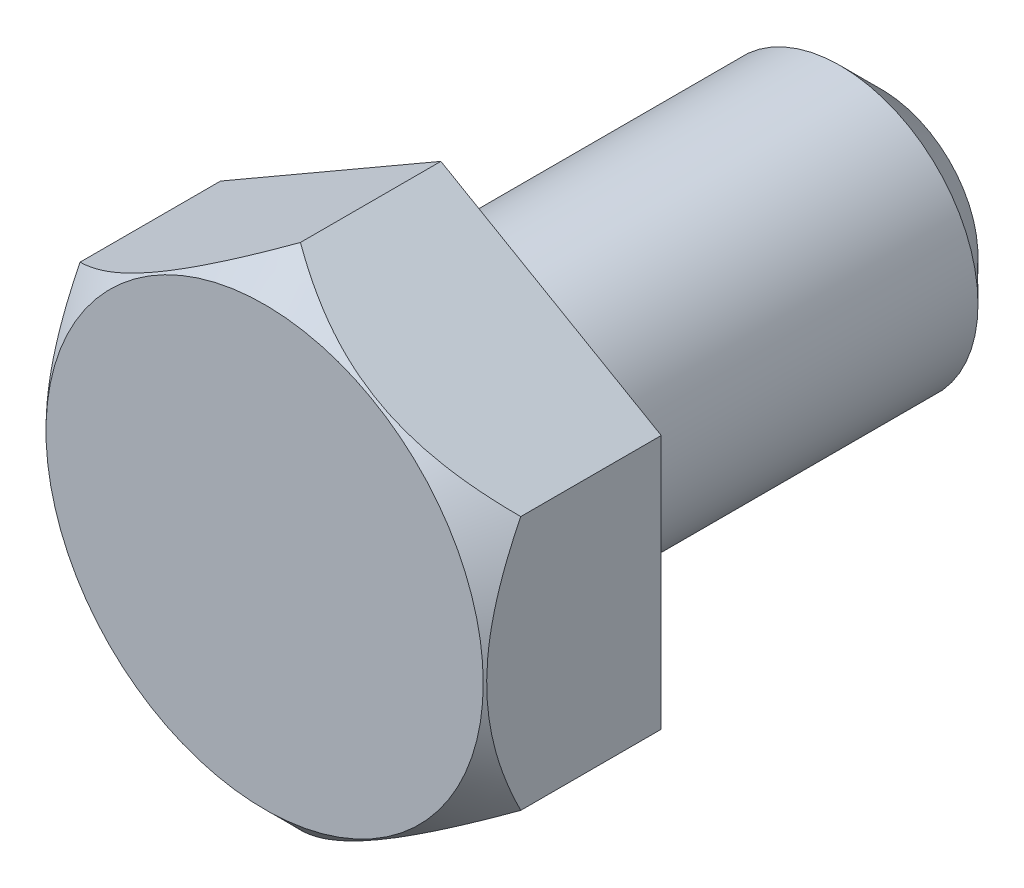
ISO-10303-21;
HEADER;
FILE_DESCRIPTION(('STEP AP214'),'2;1');
FILE_NAME('part.step','',(''),(''),'','','');
FILE_SCHEMA(('AUTOMOTIVE_DESIGN { 1 0 10303 214 1 1 1 1 }'));
ENDSEC;
DATA;
#1=APPLICATION_CONTEXT('core data for automotive mechanical design processes');
#2=APPLICATION_PROTOCOL_DEFINITION('international standard','automotive_design',2000,#1);
#3=PRODUCT_CONTEXT('',#1,'mechanical');
#4=PRODUCT('Part','Part','',(#3));
#5=PRODUCT_RELATED_PRODUCT_CATEGORY('part','',(#4));
#6=PRODUCT_DEFINITION_FORMATION('','',#4);
#7=PRODUCT_DEFINITION_CONTEXT('part definition',#1,'design');
#8=PRODUCT_DEFINITION('design','',#6,#7);
#9=PRODUCT_DEFINITION_SHAPE('','',#8);
#10=(LENGTH_UNIT() NAMED_UNIT(*) SI_UNIT(.MILLI.,.METRE.));
#11=(NAMED_UNIT(*) PLANE_ANGLE_UNIT() SI_UNIT($,.RADIAN.));
#12=(NAMED_UNIT(*) SI_UNIT($,.STERADIAN.) SOLID_ANGLE_UNIT());
#13=UNCERTAINTY_MEASURE_WITH_UNIT(LENGTH_MEASURE(1.E-05),#10,'distance_accuracy_value','');
#14=(GEOMETRIC_REPRESENTATION_CONTEXT(3) GLOBAL_UNCERTAINTY_ASSIGNED_CONTEXT((#13)) GLOBAL_UNIT_ASSIGNED_CONTEXT((#10,
#11,#12)) REPRESENTATION_CONTEXT('',''));
#15=CARTESIAN_POINT('',(0.,0.,0.));
#16=DIRECTION('',(0.,0.,1.));
#17=DIRECTION('',(1.,0.,0.));
#18=AXIS2_PLACEMENT_3D('',#15,#16,#17);
#19=CARTESIAN_POINT('',(8.,4.61880215351701,6.4));
#20=DIRECTION('',(-0.5,-0.866025403784439,0.));
#21=DIRECTION('',(0.866025403784439,-0.5,0.));
#22=AXIS2_PLACEMENT_3D('',#19,#20,#21);
#23=PLANE('',#22);
#24=CARTESIAN_POINT('',(8.0002,4.61868668346317,5.09988452778112));
#25=CARTESIAN_POINT('',(7.86264718850931,4.69810283620511,5.17929173848282));
#26=CARTESIAN_POINT('',(7.72403708946879,4.77812941419855,5.25626202615978));
#27=CARTESIAN_POINT('',(7.44449490186068,4.93952317146396,5.40458746827087));
#28=CARTESIAN_POINT('',(7.3035615952474,5.02089105397492,5.47593955604614));
#29=CARTESIAN_POINT('',(6.87565651749366,5.26794216580365,5.6810650141855));
#30=CARTESIAN_POINT('',(6.58506238022503,5.43571676918061,5.80503254964343));
#31=CARTESIAN_POINT('',(5.99905611151746,5.77404764616574,6.0173182473915));
#32=CARTESIAN_POINT('',(5.70379374903563,5.94451745062619,6.10617121244411));
#33=CARTESIAN_POINT('',(5.25604614112777,6.2030246525808,6.20895214099946));
#34=CARTESIAN_POINT('',(5.10613774993224,6.28957430259132,6.23811561978319));
#35=CARTESIAN_POINT('',(4.80505172243293,6.46340640161728,6.28561647991033));
#36=CARTESIAN_POINT('',(4.65387427922754,6.55068873914732,6.30395547906862));
#37=CARTESIAN_POINT('',(4.2854726454627,6.76338552157134,6.33470362617771));
#38=CARTESIAN_POINT('',(4.06785151206182,6.88902914152169,6.34115496190079));
#39=CARTESIAN_POINT('',(3.63300150689388,7.14008990906252,6.33032538290011));
#40=CARTESIAN_POINT('',(3.4157727993483,7.26550696183967,6.31303614927477));
#41=CARTESIAN_POINT('',(2.98336341648152,7.51515863543793,6.25574456625223));
#42=CARTESIAN_POINT('',(2.76818530541246,7.63939177578737,6.21571681806485));
#43=CARTESIAN_POINT('',(2.34152748187323,7.8857227850596,6.11512435942803));
#44=CARTESIAN_POINT('',(2.1300474871093,8.00782081696477,6.05456122379639));
#45=CARTESIAN_POINT('',(1.75463860257918,8.22456323750441,5.92996636349631));
#46=CARTESIAN_POINT('',(1.58987832632788,8.31968762734986,5.86921187770629));
#47=CARTESIAN_POINT('',(1.26331530740291,8.50822887423357,5.73791284582758));
#48=CARTESIAN_POINT('',(1.10151265446656,8.60164567946197,5.66736800324559));
#49=CARTESIAN_POINT('',(0.781374515263976,8.78647752030844,5.51806952990987));
#50=CARTESIAN_POINT('',(0.623029924219257,8.87789781257283,5.43934171455633));
#51=CARTESIAN_POINT('',(0.309272732360313,9.05904561175277,5.27471082572869));
#52=CARTESIAN_POINT('',(0.153858404368318,9.14877411585488,5.18881215204212));
#53=CARTESIAN_POINT('',(-0.000200000000000165,9.23771977708785,5.09988452778112));
#54=B_SPLINE_CURVE_WITH_KNOTS('',3,(#24,#25,#26,#27,#28,#29,#30,#31,#32,#33,#34,#35,#36,#37,#38,
#39,#40,#41,#42,#43,#44,#45,#46,#47,#48,#49,#50,#51,#52,#53),.UNSPECIFIED.,.F.,.F.,(4,2,2,2,2,2,
2,2,2,2,2,2,2,2,4),(0.,0.53269658039059,1.06568194267353,2.13740664213606,3.19211397028664,
3.71843331125697,4.244673969182,4.99761238034705,5.75081469500556,6.50485999129144,
7.25884747442539,7.85770857481704,8.45658781520819,9.05363199316845,9.65031250088063),.UNSPECIFIED.);
#55=CARTESIAN_POINT('',(8.,4.61880215351701,5.1));
#56=VERTEX_POINT('',#55);
#57=CARTESIAN_POINT('',(0.,9.23760430703401,5.1));
#58=VERTEX_POINT('',#57);
#59=EDGE_CURVE('E83',#56,#58,#54,.T.);
#60=ORIENTED_EDGE('',*,*,#59,.F.);
#61=DIRECTION('',(0.,0.,-1.));
#62=VECTOR('',#61,1.);
#63=CARTESIAN_POINT('',(8.,4.61880215351701,6.4));
#64=LINE('',#63,#62);
#65=CARTESIAN_POINT('',(8.,4.61880215351701,0.));
#66=VERTEX_POINT('',#65);
#67=EDGE_CURVE('E52',#56,#66,#64,.T.);
#68=ORIENTED_EDGE('',*,*,#67,.T.);
#69=DIRECTION('',(-0.866025403784439,0.5,0.));
#70=VECTOR('',#69,1.);
#71=CARTESIAN_POINT('',(8.,4.61880215351701,0.));
#72=LINE('',#71,#70);
#73=CARTESIAN_POINT('',(0.,9.23760430703401,0.));
#74=VERTEX_POINT('',#73);
#75=EDGE_CURVE('E91',#66,#74,#72,.T.);
#76=ORIENTED_EDGE('',*,*,#75,.T.);
#77=DIRECTION('',(0.,0.,-1.));
#78=VECTOR('',#77,1.);
#79=CARTESIAN_POINT('',(0.,9.23760430703401,6.4));
#80=LINE('',#79,#78);
#81=EDGE_CURVE('E90',#58,#74,#80,.T.);
#82=ORIENTED_EDGE('',*,*,#81,.F.);
#83=EDGE_LOOP('',(#60,#68,#76,#82));
#84=FACE_BOUND('',#83,.T.);
#85=ADVANCED_FACE('F29',(#84),#23,.F.);
#86=CARTESIAN_POINT('',(0.,9.23760430703401,6.4));
#87=DIRECTION('',(0.5,-0.866025403784439,0.));
#88=DIRECTION('',(0.866025403784439,0.5,0.));
#89=AXIS2_PLACEMENT_3D('',#86,#87,#88);
#90=PLANE('',#89);
#91=CARTESIAN_POINT('',(0.000200000000000048,9.23771977708785,5.09988452778113));
#92=CARTESIAN_POINT('',(-0.137352811490684,9.15830362434591,5.17929173848282));
#93=CARTESIAN_POINT('',(-0.275962910531205,9.07827704635247,5.25626202615978));
#94=CARTESIAN_POINT('',(-0.555505098139321,8.91688328908706,5.40458746827087));
#95=CARTESIAN_POINT('',(-0.696438404752601,8.8355154065761,5.47593955604614));
#96=CARTESIAN_POINT('',(-1.12434348250634,8.58846429474738,5.6810650141855));
#97=CARTESIAN_POINT('',(-1.41493761977496,8.42068969137041,5.80503254964343));
#98=CARTESIAN_POINT('',(-2.00094388848254,8.08235881438528,6.0173182473915));
#99=CARTESIAN_POINT('',(-2.29620625096436,7.91188900992484,6.10617121244411));
#100=CARTESIAN_POINT('',(-2.74395385887223,7.65338180797022,6.20895214099946));
#101=CARTESIAN_POINT('',(-2.89386225006775,7.5668321579597,6.23811561978319));
#102=CARTESIAN_POINT('',(-3.19494827756706,7.39300005893374,6.28561647991033));
#103=CARTESIAN_POINT('',(-3.34612572077245,7.3057177214037,6.30395547906862));
#104=CARTESIAN_POINT('',(-3.71452735453729,7.09302093897968,6.33470362617772));
#105=CARTESIAN_POINT('',(-3.93214848793817,6.96737731902933,6.34115496190079));
#106=CARTESIAN_POINT('',(-4.36699849310612,6.7163165514885,6.33032538290011));
#107=CARTESIAN_POINT('',(-4.5842272006517,6.59089949871135,6.31303614927477));
#108=CARTESIAN_POINT('',(-5.01663658351847,6.3412478251131,6.25574456625223));
#109=CARTESIAN_POINT('',(-5.23181469458754,6.21701468476366,6.21571681806485));
#110=CARTESIAN_POINT('',(-5.65847251812676,5.97068367549142,6.11512435942804));
#111=CARTESIAN_POINT('',(-5.8699525128907,5.84858564358625,6.05456122379639));
#112=CARTESIAN_POINT('',(-6.24536139742081,5.63184322304661,5.92996636349631));
#113=CARTESIAN_POINT('',(-6.41012167367211,5.53671883320116,5.86921187770629));
#114=CARTESIAN_POINT('',(-6.73668469259708,5.34817758631745,5.73791284582758));
#115=CARTESIAN_POINT('',(-6.89848734553344,5.25476078108905,5.6673680032456));
#116=CARTESIAN_POINT('',(-7.21862548473602,5.06992894024258,5.51806952990987));
#117=CARTESIAN_POINT('',(-7.37697007578074,4.97850864797819,5.43934171455634));
#118=CARTESIAN_POINT('',(-7.69072726763969,4.79736084879824,5.27471082572869));
#119=CARTESIAN_POINT('',(-7.84614159563168,4.70763234469614,5.18881215204212));
#120=CARTESIAN_POINT('',(-8.0002,4.61868668346317,5.09988452778112));
#121=B_SPLINE_CURVE_WITH_KNOTS('',3,(#91,#92,#93,#94,#95,#96,#97,#98,#99,#100,#101,#102,#103,
#104,#105,#106,#107,#108,#109,#110,#111,#112,#113,#114,#115,#116,#117,#118,#119,#120),
.UNSPECIFIED.,.F.,.F.,(4,2,2,2,2,2,2,2,2,2,2,2,2,2,4),(0.,0.532696580390589,1.06568194267353,
2.13740664213606,3.19211397028664,3.71843331125696,4.24467396918199,4.99761238034705,
5.75081469500556,6.50485999129143,7.25884747442539,7.85770857481704,8.45658781520819,
9.05363199316846,9.65031250088063),.UNSPECIFIED.);
#122=CARTESIAN_POINT('',(-8.,4.618802153517,5.1));
#123=VERTEX_POINT('',#122);
#124=EDGE_CURVE('E92',#58,#123,#121,.T.);
#125=ORIENTED_EDGE('',*,*,#124,.F.);
#126=ORIENTED_EDGE('',*,*,#81,.T.);
#127=DIRECTION('',(-0.866025403784439,-0.5,0.));
#128=VECTOR('',#127,1.);
#129=CARTESIAN_POINT('',(0.,9.23760430703401,0.));
#130=LINE('',#129,#128);
#131=CARTESIAN_POINT('',(-8.,4.618802153517,0.));
#132=VERTEX_POINT('',#131);
#133=EDGE_CURVE('E251',#74,#132,#130,.T.);
#134=ORIENTED_EDGE('',*,*,#133,.T.);
#135=DIRECTION('',(0.,0.,-1.));
#136=VECTOR('',#135,1.);
#137=CARTESIAN_POINT('',(-8.,4.618802153517,6.4));
#138=LINE('',#137,#136);
#139=EDGE_CURVE('E109',#123,#132,#138,.T.);
#140=ORIENTED_EDGE('',*,*,#139,.F.);
#141=EDGE_LOOP('',(#125,#126,#134,#140));
#142=FACE_BOUND('',#141,.T.);
#143=ADVANCED_FACE('F133',(#142),#90,.F.);
#144=CARTESIAN_POINT('',(-8.,4.618802153517,6.4));
#145=DIRECTION('',(1.,0.,0.));
#146=DIRECTION('',(0.,1.,0.));
#147=AXIS2_PLACEMENT_3D('',#144,#145,#146);
#148=PLANE('',#147);
#149=CARTESIAN_POINT('',(-8.,-9.61389015023381,1.83053095549559));
#150=CARTESIAN_POINT('',(-8.,-9.38152572250294,2.00910383132847));
#151=CARTESIAN_POINT('',(-8.,-9.14790641603414,2.18606953366341));
#152=CARTESIAN_POINT('',(-8.,-8.67764616113104,2.5360531726716));
#153=CARTESIAN_POINT('',(-8.,-8.44100450851385,2.70907016215568));
#154=CARTESIAN_POINT('',(-8.,-7.96245808786404,3.05165429149538));
#155=CARTESIAN_POINT('',(-8.,-7.72052679612856,3.2211845025038));
#156=CARTESIAN_POINT('',(-8.,-7.2326328662152,3.55432128522535));
#157=CARTESIAN_POINT('',(-8.,-6.98667050770215,3.71792826537067));
#158=CARTESIAN_POINT('',(-8.,-6.47438498750819,4.04795542830921));
#159=CARTESIAN_POINT('',(-8.,-6.20775571179409,4.21390283073444));
#160=CARTESIAN_POINT('',(-8.,-5.66823746364956,4.53546291798596));
#161=CARTESIAN_POINT('',(-8.,-5.3953474516123,4.69107386946841));
#162=CARTESIAN_POINT('',(-8.,-4.84323887478905,4.98864450305183));
#163=CARTESIAN_POINT('',(-8.,-4.56404208250335,5.13064426562094));
#164=CARTESIAN_POINT('',(-8.,-3.99777151051503,5.39781114118907));
#165=CARTESIAN_POINT('',(-8.,-3.71070151546477,5.52298617682213));
#166=CARTESIAN_POINT('',(-8.,-3.15652255839386,5.74078737424941));
#167=CARTESIAN_POINT('',(-8.,-2.8902016597359,5.83539830082898));
#168=CARTESIAN_POINT('',(-8.,-2.35079630253478,6.0033005921707));
#169=CARTESIAN_POINT('',(-8.,-2.07771141254367,6.07659059313639));
#170=CARTESIAN_POINT('',(-8.,-1.53115234877902,6.19667094005732));
#171=CARTESIAN_POINT('',(-8.,-1.25778535982095,6.24394096704607));
#172=CARTESIAN_POINT('',(-8.,-0.707682477416291,6.31099892174061));
#173=CARTESIAN_POINT('',(-8.,-0.430947287198859,6.33079249009045));
#174=CARTESIAN_POINT('',(-8.,0.111101381414232,6.34122393011303));
#175=CARTESIAN_POINT('',(-8.,0.376391558570336,6.3330849702453));
#176=CARTESIAN_POINT('',(-8.,0.904890409352581,6.29090302128884));
#177=CARTESIAN_POINT('',(-8.,1.16809889086723,6.25685766894673));
#178=CARTESIAN_POINT('',(-8.,1.69498934000622,6.16420531579391));
#179=CARTESIAN_POINT('',(-8.,1.95859392059617,6.10516560573445));
#180=CARTESIAN_POINT('',(-8.,2.48000205383373,5.96579252269791));
#181=CARTESIAN_POINT('',(-8.,2.73780594442,5.88546039368493));
#182=CARTESIAN_POINT('',(-8.,3.2623102629903,5.70170600976986));
#183=CARTESIAN_POINT('',(-8.,3.52862391249367,5.59719216211448));
#184=CARTESIAN_POINT('',(-8.,4.05439794854973,5.37202253723415));
#185=CARTESIAN_POINT('',(-8.,4.31385517584002,5.25135946897154));
#186=CARTESIAN_POINT('',(-8.,4.82714379152122,4.99675329112533));
#187=CARTESIAN_POINT('',(-8.,5.08095470346259,4.86276923562776));
#188=CARTESIAN_POINT('',(-8.,5.58275937170433,4.58447022223644));
#189=CARTESIAN_POINT('',(-8.,5.83075401737561,4.44015685766289));
#190=CARTESIAN_POINT('',(-8.,6.30956271238243,4.15055038081267));
#191=CARTESIAN_POINT('',(-8.,6.54062030872522,4.00565779933843));
#192=CARTESIAN_POINT('',(-8.,6.99876587756581,3.7097087758043));
#193=CARTESIAN_POINT('',(-8.,7.22585355043858,3.55865187134411));
#194=CARTESIAN_POINT('',(-8.,7.67475205811636,3.25270423317242));
#195=CARTESIAN_POINT('',(-8.,7.8965906292664,3.09785404904156));
#196=CARTESIAN_POINT('',(-8.,8.33722498019734,2.78400533629447));
#197=CARTESIAN_POINT('',(-8.,8.55602158184875,2.62500796290782));
#198=CARTESIAN_POINT('',(-8.,8.77354223295507,2.46431313257668));
#199=B_SPLINE_CURVE_WITH_KNOTS('',3,(#149,#150,#151,#152,#153,#154,#155,#156,#157,#158,#159,
#160,#161,#162,#163,#164,#165,#166,#167,#168,#169,#170,#171,#172,#173,#174,#175,#176,#177,#178,
#179,#180,#181,#182,#183,#184,#185,#186,#187,#188,#189,#190,#191,#192,#193,#194,#195,#196,#197,
#198),.UNSPECIFIED.,.F.,.F.,(4,2,2,2,2,2,2,2,2,2,2,2,2,2,2,2,2,2,2,2,2,2,2,2,4),(0.,
0.879182564285962,1.75857385000919,2.64475180555538,3.53086853849448,4.47284327062379,
5.41497556800331,6.35424239625197,7.29306536976883,8.1402149884767,8.98741878333842,
9.81843117108836,10.6492729350071,11.4442047185884,12.2392090267591,13.0485789576989,
13.8579016133479,14.7155062558755,15.5734994035005,16.4342165519729,17.2948012177467,
18.1128755592933,18.931011379721,19.7425744792568,20.5539138767035),.UNSPECIFIED.);
#200=CARTESIAN_POINT('',(-8.,-4.61880215351701,5.1));
#201=VERTEX_POINT('',#200);
#202=EDGE_CURVE('E154',#123,#201,#199,.F.);
#203=ORIENTED_EDGE('',*,*,#202,.F.);
#204=ORIENTED_EDGE('',*,*,#139,.T.);
#205=DIRECTION('',(0.,-1.,0.));
#206=VECTOR('',#205,1.);
#207=CARTESIAN_POINT('',(-8.,4.618802153517,0.));
#208=LINE('',#207,#206);
#209=CARTESIAN_POINT('',(-8.,-4.61880215351701,0.));
#210=VERTEX_POINT('',#209);
#211=EDGE_CURVE('E252',#132,#210,#208,.T.);
#212=ORIENTED_EDGE('',*,*,#211,.T.);
#213=DIRECTION('',(0.,0.,-1.));
#214=VECTOR('',#213,1.);
#215=CARTESIAN_POINT('',(-8.,-4.61880215351701,6.4));
#216=LINE('',#215,#214);
#217=EDGE_CURVE('E107',#201,#210,#216,.T.);
#218=ORIENTED_EDGE('',*,*,#217,.F.);
#219=EDGE_LOOP('',(#203,#204,#212,#218));
#220=FACE_BOUND('',#219,.T.);
#221=ADVANCED_FACE('F138',(#220),#148,.F.);
#222=CARTESIAN_POINT('',(-8.,-4.61880215351701,6.4));
#223=DIRECTION('',(0.5,0.866025403784439,0.));
#224=DIRECTION('',(-0.866025403784439,0.5,0.));
#225=AXIS2_PLACEMENT_3D('',#222,#223,#224);
#226=PLANE('',#225);
#227=CARTESIAN_POINT('',(-8.0002,-4.61868668346317,5.09988452778112));
#228=CARTESIAN_POINT('',(-7.86264718850931,-4.69810283620511,5.17929173848282));
#229=CARTESIAN_POINT('',(-7.72403708946879,-4.77812941419855,5.25626202615978));
#230=CARTESIAN_POINT('',(-7.44449490186068,-4.93952317146395,5.40458746827087));
#231=CARTESIAN_POINT('',(-7.3035615952474,-5.02089105397492,5.47593955604614));
#232=CARTESIAN_POINT('',(-6.87565651749366,-5.26794216580364,5.6810650141855));
#233=CARTESIAN_POINT('',(-6.58506238022504,-5.43571676918061,5.80503254964343));
#234=CARTESIAN_POINT('',(-5.99905611151746,-5.77404764616574,6.0173182473915));
#235=CARTESIAN_POINT('',(-5.70379374903564,-5.94451745062618,6.10617121244411));
#236=CARTESIAN_POINT('',(-5.25604614112777,-6.2030246525808,6.20895214099946));
#237=CARTESIAN_POINT('',(-5.10613774993225,-6.28957430259132,6.23811561978319));
#238=CARTESIAN_POINT('',(-4.80505172243294,-6.46340640161728,6.28561647991033));
#239=CARTESIAN_POINT('',(-4.65387427922755,-6.55068873914731,6.30395547906862));
#240=CARTESIAN_POINT('',(-4.28547264546271,-6.76338552157134,6.33470362617771));
#241=CARTESIAN_POINT('',(-4.06785151206183,-6.88902914152169,6.34115496190079));
#242=CARTESIAN_POINT('',(-3.63300150689388,-7.14008990906251,6.33032538290011));
#243=CARTESIAN_POINT('',(-3.4157727993483,-7.26550696183967,6.31303614927477));
#244=CARTESIAN_POINT('',(-2.98336341648153,-7.51515863543792,6.25574456625223));
#245=CARTESIAN_POINT('',(-2.76818530541246,-7.63939177578736,6.21571681806485));
#246=CARTESIAN_POINT('',(-2.34152748187324,-7.88572278505959,6.11512435942803));
#247=CARTESIAN_POINT('',(-2.1300474871093,-8.00782081696477,6.05456122379639));
#248=CARTESIAN_POINT('',(-1.75463860257919,-8.22456323750441,5.92996636349631));
#249=CARTESIAN_POINT('',(-1.58987832632789,-8.31968762734986,5.86921187770629));
#250=CARTESIAN_POINT('',(-1.26331530740291,-8.50822887423356,5.73791284582758));
#251=CARTESIAN_POINT('',(-1.10151265446656,-8.60164567946196,5.66736800324559));
#252=CARTESIAN_POINT('',(-0.781374515263977,-8.78647752030844,5.51806952990987));
#253=CARTESIAN_POINT('',(-0.623029924219258,-8.87789781257283,5.43934171455634));
#254=CARTESIAN_POINT('',(-0.309272732360314,-9.05904561175277,5.27471082572869));
#255=CARTESIAN_POINT('',(-0.153858404368317,-9.14877411585488,5.18881215204212));
#256=CARTESIAN_POINT('',(0.000200000000002336,-9.23771977708785,5.09988452778112));
#257=B_SPLINE_CURVE_WITH_KNOTS('',3,(#227,#228,#229,#230,#231,#232,#233,#234,#235,#236,#237,
#238,#239,#240,#241,#242,#243,#244,#245,#246,#247,#248,#249,#250,#251,#252,#253,#254,#255,#256),
.UNSPECIFIED.,.F.,.F.,(4,2,2,2,2,2,2,2,2,2,2,2,2,2,4),(0.,0.53269658039059,1.06568194267353,
2.13740664213606,3.19211397028664,3.71843331125696,4.24467396918199,4.99761238034704,
5.75081469500556,6.50485999129143,7.25884747442539,7.85770857481704,8.45658781520819,
9.05363199316845,9.65031250088063),.UNSPECIFIED.);
#258=CARTESIAN_POINT('',(0.,-9.23760430703401,5.1));
#259=VERTEX_POINT('',#258);
#260=EDGE_CURVE('E183',#201,#259,#257,.T.);
#261=ORIENTED_EDGE('',*,*,#260,.F.);
#262=ORIENTED_EDGE('',*,*,#217,.T.);
#263=DIRECTION('',(0.866025403784439,-0.5,0.));
#264=VECTOR('',#263,1.);
#265=CARTESIAN_POINT('',(-8.,-4.61880215351701,0.));
#266=LINE('',#265,#264);
#267=CARTESIAN_POINT('',(0.,-9.23760430703401,0.));
#268=VERTEX_POINT('',#267);
#269=EDGE_CURVE('E257',#210,#268,#266,.T.);
#270=ORIENTED_EDGE('',*,*,#269,.T.);
#271=DIRECTION('',(0.,0.,-1.));
#272=VECTOR('',#271,1.);
#273=CARTESIAN_POINT('',(0.,-9.23760430703401,6.4));
#274=LINE('',#273,#272);
#275=EDGE_CURVE('E100',#259,#268,#274,.T.);
#276=ORIENTED_EDGE('',*,*,#275,.F.);
#277=EDGE_LOOP('',(#261,#262,#270,#276));
#278=FACE_BOUND('',#277,.T.);
#279=ADVANCED_FACE('F143',(#278),#226,.F.);
#280=CARTESIAN_POINT('',(0.,-9.23760430703401,6.4));
#281=DIRECTION('',(-0.5,0.866025403784439,0.));
#282=DIRECTION('',(-0.866025403784439,-0.5,0.));
#283=AXIS2_PLACEMENT_3D('',#280,#281,#282);
#284=PLANE('',#283);
#285=CARTESIAN_POINT('',(-0.000199999999998023,-9.23771977708785,5.09988452778112));
#286=CARTESIAN_POINT('',(0.137352811490687,-9.15830362434592,5.17929173848282));
#287=CARTESIAN_POINT('',(0.275962910531208,-9.07827704635247,5.25626202615978));
#288=CARTESIAN_POINT('',(0.555505098139323,-8.91688328908707,5.40458746827087));
#289=CARTESIAN_POINT('',(0.696438404752604,-8.83551540657611,5.47593955604614));
#290=CARTESIAN_POINT('',(1.12434348250634,-8.58846429474738,5.6810650141855));
#291=CARTESIAN_POINT('',(1.41493761977496,-8.42068969137041,5.80503254964343));
#292=CARTESIAN_POINT('',(2.00094388848254,-8.08235881438528,6.0173182473915));
#293=CARTESIAN_POINT('',(2.29620625096437,-7.91188900992484,6.10617121244411));
#294=CARTESIAN_POINT('',(2.74395385887223,-7.65338180797022,6.20895214099946));
#295=CARTESIAN_POINT('',(2.89386225006775,-7.5668321579597,6.23811561978319));
#296=CARTESIAN_POINT('',(3.19494827756706,-7.39300005893374,6.28561647991032));
#297=CARTESIAN_POINT('',(3.34612572077245,-7.30571772140371,6.30395547906862));
#298=CARTESIAN_POINT('',(3.71452735453729,-7.09302093897968,6.33470362617771));
#299=CARTESIAN_POINT('',(3.93214848793817,-6.96737731902933,6.34115496190079));
#300=CARTESIAN_POINT('',(4.36699849310612,-6.71631655148851,6.33032538290011));
#301=CARTESIAN_POINT('',(4.5842272006517,-6.59089949871135,6.31303614927477));
#302=CARTESIAN_POINT('',(5.01663658351847,-6.3412478251131,6.25574456625223));
#303=CARTESIAN_POINT('',(5.23181469458754,-6.21701468476366,6.21571681806485));
#304=CARTESIAN_POINT('',(5.65847251812677,-5.97068367549143,6.11512435942803));
#305=CARTESIAN_POINT('',(5.8699525128907,-5.84858564358625,6.05456122379639));
#306=CARTESIAN_POINT('',(6.24536139742081,-5.63184322304661,5.92996636349631));
#307=CARTESIAN_POINT('',(6.41012167367211,-5.53671883320116,5.86921187770628));
#308=CARTESIAN_POINT('',(6.73668469259709,-5.34817758631745,5.73791284582758));
#309=CARTESIAN_POINT('',(6.89848734553344,-5.25476078108906,5.66736800324559));
#310=CARTESIAN_POINT('',(7.21862548473602,-5.06992894024258,5.51806952990987));
#311=CARTESIAN_POINT('',(7.37697007578074,-4.97850864797819,5.43934171455633));
#312=CARTESIAN_POINT('',(7.69072726763969,-4.79736084879825,5.27471082572869));
#313=CARTESIAN_POINT('',(7.84614159563169,-4.70763234469614,5.18881215204211));
#314=CARTESIAN_POINT('',(8.0002,-4.61868668346317,5.09988452778112));
#315=B_SPLINE_CURVE_WITH_KNOTS('',3,(#285,#286,#287,#288,#289,#290,#291,#292,#293,#294,#295,
#296,#297,#298,#299,#300,#301,#302,#303,#304,#305,#306,#307,#308,#309,#310,#311,#312,#313,#314),
.UNSPECIFIED.,.F.,.F.,(4,2,2,2,2,2,2,2,2,2,2,2,2,2,4),(0.,0.53269658039059,1.06568194267353,
2.13740664213606,3.19211397028664,3.71843331125696,4.24467396918199,4.99761238034704,
5.75081469500556,6.50485999129143,7.25884747442539,7.85770857481704,8.45658781520819,
9.05363199316846,9.65031250088063),.UNSPECIFIED.);
#316=CARTESIAN_POINT('',(8.,-4.61880215351701,5.1));
#317=VERTEX_POINT('',#316);
#318=EDGE_CURVE('E44',#259,#317,#315,.T.);
#319=ORIENTED_EDGE('',*,*,#318,.F.);
#320=ORIENTED_EDGE('',*,*,#275,.T.);
#321=DIRECTION('',(0.866025403784439,0.5,0.));
#322=VECTOR('',#321,1.);
#323=CARTESIAN_POINT('',(0.,-9.23760430703401,0.));
#324=LINE('',#323,#322);
#325=CARTESIAN_POINT('',(8.,-4.61880215351701,0.));
#326=VERTEX_POINT('',#325);
#327=EDGE_CURVE('E102',#268,#326,#324,.T.);
#328=ORIENTED_EDGE('',*,*,#327,.T.);
#329=DIRECTION('',(0.,0.,-1.));
#330=VECTOR('',#329,1.);
#331=CARTESIAN_POINT('',(8.,-4.61880215351701,6.4));
#332=LINE('',#331,#330);
#333=EDGE_CURVE('E98',#317,#326,#332,.T.);
#334=ORIENTED_EDGE('',*,*,#333,.F.);
#335=EDGE_LOOP('',(#319,#320,#328,#334));
#336=FACE_BOUND('',#335,.T.);
#337=ADVANCED_FACE('F189',(#336),#284,.F.);
#338=CARTESIAN_POINT('',(8.,-4.61880215351701,6.4));
#339=DIRECTION('',(-1.,0.,0.));
#340=DIRECTION('',(0.,-1.,0.));
#341=AXIS2_PLACEMENT_3D('',#338,#339,#340);
#342=PLANE('',#341);
#343=CARTESIAN_POINT('',(8.00000000000001,-9.6138901502366,1.83053095549344));
#344=CARTESIAN_POINT('',(8.00000000000001,-9.38152572250565,2.0091038313264));
#345=CARTESIAN_POINT('',(8.00000000000001,-9.14790641603677,2.18606953366142));
#346=CARTESIAN_POINT('',(8.00000000000001,-8.6776461611335,2.53605317266978));
#347=CARTESIAN_POINT('',(8.00000000000001,-8.44100450851623,2.70907016215394));
#348=CARTESIAN_POINT('',(8.00000000000001,-7.96245808786625,3.05165429149381));
#349=CARTESIAN_POINT('',(8.00000000000001,-7.7205267961307,3.22118450250231));
#350=CARTESIAN_POINT('',(8.00000000000001,-7.23263286621716,3.55432128522403));
#351=CARTESIAN_POINT('',(8.00000000000001,-6.98667050770403,3.71792826536942));
#352=CARTESIAN_POINT('',(8.00000000000001,-6.47438498750989,4.04795542830814));
#353=CARTESIAN_POINT('',(8.,-6.20775571179569,4.21390283073346));
#354=CARTESIAN_POINT('',(8.,-5.66823746365095,4.53546291798515));
#355=CARTESIAN_POINT('',(8.,-5.39534745161359,4.69107386946768));
#356=CARTESIAN_POINT('',(8.,-4.84323887479013,4.98864450305127));
#357=CARTESIAN_POINT('',(8.,-4.56404208250432,5.13064426562046));
#358=CARTESIAN_POINT('',(8.,-3.99777151051579,5.39781114118873));
#359=CARTESIAN_POINT('',(8.,-3.71070151546541,5.52298617682186));
#360=CARTESIAN_POINT('',(8.,-3.15652255839445,5.74078737424919));
#361=CARTESIAN_POINT('',(8.,-2.89020165973656,5.83539830082875));
#362=CARTESIAN_POINT('',(8.,-2.35079630253558,6.00330059217046));
#363=CARTESIAN_POINT('',(8.,-2.07771141254455,6.07659059313616));
#364=CARTESIAN_POINT('',(8.,-1.53115234878004,6.19667094005712));
#365=CARTESIAN_POINT('',(8.,-1.25778535982204,6.2439409670459));
#366=CARTESIAN_POINT('',(8.,-0.707682477417522,6.3109989217405));
#367=CARTESIAN_POINT('',(8.,-0.430947287200158,6.33079249009037));
#368=CARTESIAN_POINT('',(8.,0.111101381412815,6.34122393011305));
#369=CARTESIAN_POINT('',(8.,0.37639155856887,6.33308497024537));
#370=CARTESIAN_POINT('',(8.,0.904890409351022,6.29090302128902));
#371=CARTESIAN_POINT('',(8.,1.16809889086563,6.25685766894696));
#372=CARTESIAN_POINT('',(8.,1.69498934000453,6.16420531579426));
#373=CARTESIAN_POINT('',(8.,1.95859392059444,6.10516560573486));
#374=CARTESIAN_POINT('',(8.,2.48000205383192,5.96579252269844));
#375=CARTESIAN_POINT('',(8.,2.73780594441815,5.88546039368553));
#376=CARTESIAN_POINT('',(8.,3.26231026298824,5.70170600977064));
#377=CARTESIAN_POINT('',(8.,3.52862391249144,5.59719216211539));
#378=CARTESIAN_POINT('',(8.,4.05439794854716,5.37202253723532));
#379=CARTESIAN_POINT('',(8.,4.31385517583727,5.25135946897284));
#380=CARTESIAN_POINT('',(8.,4.82714379151816,4.99675329112692));
#381=CARTESIAN_POINT('',(8.,5.08095470345936,4.8627692356295));
#382=CARTESIAN_POINT('',(8.,5.58275937170079,4.58447022223847));
#383=CARTESIAN_POINT('',(8.,5.83075401737192,4.44015685766507));
#384=CARTESIAN_POINT('',(8.,6.30956271237846,4.15055038081514));
#385=CARTESIAN_POINT('',(8.,6.54062030872112,4.00565779934102));
#386=CARTESIAN_POINT('',(8.,6.99876587756146,3.70970877580717));
#387=CARTESIAN_POINT('',(8.,7.2258535504341,3.55865187134712));
#388=CARTESIAN_POINT('',(8.,7.67475205811164,3.25270423317569));
#389=CARTESIAN_POINT('',(8.,7.89659062926156,3.09785404904497));
#390=CARTESIAN_POINT('',(8.,8.33722498019226,2.78400533629814));
#391=CARTESIAN_POINT('',(8.,8.55602158184355,2.62500796291162));
#392=CARTESIAN_POINT('',(8.,8.77354223294976,2.46431313258062));
#393=B_SPLINE_CURVE_WITH_KNOTS('',3,(#343,#344,#345,#346,#347,#348,#349,#350,#351,#352,#353,
#354,#355,#356,#357,#358,#359,#360,#361,#362,#363,#364,#365,#366,#367,#368,#369,#370,#371,#372,
#373,#374,#375,#376,#377,#378,#379,#380,#381,#382,#383,#384,#385,#386,#387,#388,#389,#390,#391,
#392),.UNSPECIFIED.,.F.,.F.,(4,2,2,2,2,2,2,2,2,2,2,2,2,2,2,2,2,2,2,2,2,2,2,2,4),(0.,
0.879182564286303,1.75857385000987,2.64475180555641,3.53086853849586,4.47284327062556,
5.41497556800548,6.35424239625454,7.29306536977178,8.14021498847945,8.98741878334096,
9.81843117109071,10.6492729350093,11.4442047185904,12.239209026761,13.0485789577006,
13.8579016133495,14.7155062558764,15.5734994035007,16.4342165519726,17.2948012177458,
18.1128755592918,18.9310113797189,19.7425744792542,20.5539138767004),.UNSPECIFIED.);
#394=EDGE_CURVE('E81',#317,#56,#393,.T.);
#395=ORIENTED_EDGE('',*,*,#394,.F.);
#396=ORIENTED_EDGE('',*,*,#333,.T.);
#397=DIRECTION('',(0.,1.,0.));
#398=VECTOR('',#397,1.);
#399=CARTESIAN_POINT('',(8.,-4.61880215351701,0.));
#400=LINE('',#399,#398);
#401=EDGE_CURVE('E96',#326,#66,#400,.T.);
#402=ORIENTED_EDGE('',*,*,#401,.T.);
#403=ORIENTED_EDGE('',*,*,#67,.F.);
#404=EDGE_LOOP('',(#395,#396,#402,#403));
#405=FACE_BOUND('',#404,.T.);
#406=ADVANCED_FACE('F94',(#405),#342,.F.);
#407=CARTESIAN_POINT('',(-8.00000000000001,13.856406460551,0.));
#408=DIRECTION('',(0.,0.,1.));
#409=DIRECTION('',(1.,0.,0.));
#410=AXIS2_PLACEMENT_3D('',#407,#408,#409);
#411=PLANE('',#410);
#412=ORIENTED_EDGE('',*,*,#75,.F.);
#413=ORIENTED_EDGE('',*,*,#401,.F.);
#414=ORIENTED_EDGE('',*,*,#327,.F.);
#415=ORIENTED_EDGE('',*,*,#269,.F.);
#416=ORIENTED_EDGE('',*,*,#211,.F.);
#417=ORIENTED_EDGE('',*,*,#133,.F.);
#418=EDGE_LOOP('',(#412,#413,#414,#415,#416,#417));
#419=FACE_BOUND('',#418,.T.);
#420=CARTESIAN_POINT('',(0.,0.,0.));
#421=DIRECTION('',(0.,0.,1.));
#422=DIRECTION('',(1.,0.,0.));
#423=AXIS2_PLACEMENT_3D('',#420,#421,#422);
#424=CIRCLE('',#423,5.);
#425=CARTESIAN_POINT('',(5.,0.,0.));
#426=VERTEX_POINT('',#425);
#427=EDGE_CURVE('E112',#426,#426,#424,.F.);
#428=ORIENTED_EDGE('',*,*,#427,.F.);
#429=EDGE_LOOP('',(#428));
#430=FACE_BOUND('',#429,.T.);
#431=ADVANCED_FACE('F196',(#419,#430),#411,.F.);
#432=CARTESIAN_POINT('',(0.,0.,-16.));
#433=DIRECTION('',(0.,0.,1.));
#434=DIRECTION('',(1.,0.,0.));
#435=AXIS2_PLACEMENT_3D('',#432,#433,#434);
#436=CYLINDRICAL_SURFACE('',#435,5.);
#437=CARTESIAN_POINT('',(0.,0.,-14.5));
#438=DIRECTION('',(0.,0.,-1.));
#439=DIRECTION('',(-1.,0.,0.));
#440=AXIS2_PLACEMENT_3D('',#437,#438,#439);
#441=CIRCLE('',#440,5.);
#442=CARTESIAN_POINT('',(-5.,0.,-14.5));
#443=VERTEX_POINT('',#442);
#444=EDGE_CURVE('E11',#443,#443,#441,.F.);
#445=ORIENTED_EDGE('',*,*,#444,.T.);
#446=EDGE_LOOP('',(#445));
#447=FACE_BOUND('',#446,.T.);
#448=ORIENTED_EDGE('',*,*,#427,.T.);
#449=EDGE_LOOP('',(#448));
#450=FACE_BOUND('',#449,.T.);
#451=ADVANCED_FACE('F198',(#447,#450),#436,.T.);
#452=CARTESIAN_POINT('',(0.,0.,-16.));
#453=DIRECTION('',(0.,0.,-1.));
#454=DIRECTION('',(-1.,0.,0.));
#455=AXIS2_PLACEMENT_3D('',#452,#453,#454);
#456=PLANE('',#455);
#457=CARTESIAN_POINT('',(0.,0.,-16.));
#458=DIRECTION('',(0.,0.,-1.));
#459=DIRECTION('',(-1.,0.,0.));
#460=AXIS2_PLACEMENT_3D('',#457,#458,#459);
#461=CIRCLE('',#460,3.50000000000001);
#462=CARTESIAN_POINT('',(-3.50000000000001,0.,-16.));
#463=VERTEX_POINT('',#462);
#464=EDGE_CURVE('E37',#463,#463,#461,.T.);
#465=ORIENTED_EDGE('',*,*,#464,.T.);
#466=EDGE_LOOP('',(#465));
#467=FACE_BOUND('',#466,.T.);
#468=ADVANCED_FACE('F117',(#467),#456,.T.);
#469=CARTESIAN_POINT('',(0.,0.,6.4));
#470=DIRECTION('',(0.,0.,-1.));
#471=DIRECTION('',(-1.,0.,0.));
#472=AXIS2_PLACEMENT_3D('',#469,#470,#471);
#473=CONICAL_SURFACE('',#472,7.93760430703401,0.785398163397449);
#474=CARTESIAN_POINT('',(0.,0.,6.4));
#475=DIRECTION('',(0.,0.,1.));
#476=DIRECTION('',(1.,0.,0.));
#477=AXIS2_PLACEMENT_3D('',#474,#475,#476);
#478=CIRCLE('',#477,7.93760430703401);
#479=CARTESIAN_POINT('',(7.93760430703401,0.,6.4));
#480=VERTEX_POINT('',#479);
#481=EDGE_CURVE('E87',#480,#480,#478,.T.);
#482=ORIENTED_EDGE('',*,*,#481,.F.);
#483=EDGE_LOOP('',(#482));
#484=FACE_BOUND('',#483,.T.);
#485=ORIENTED_EDGE('',*,*,#59,.T.);
#486=ORIENTED_EDGE('',*,*,#124,.T.);
#487=ORIENTED_EDGE('',*,*,#202,.T.);
#488=ORIENTED_EDGE('',*,*,#260,.T.);
#489=ORIENTED_EDGE('',*,*,#318,.T.);
#490=ORIENTED_EDGE('',*,*,#394,.T.);
#491=EDGE_LOOP('',(#485,#486,#487,#488,#489,#490));
#492=FACE_BOUND('',#491,.T.);
#493=ADVANCED_FACE('F82',(#484,#492),#473,.T.);
#494=CARTESIAN_POINT('',(-8.00000000000001,13.856406460551,6.4));
#495=DIRECTION('',(0.,0.,1.));
#496=DIRECTION('',(1.,0.,0.));
#497=AXIS2_PLACEMENT_3D('',#494,#495,#496);
#498=PLANE('',#497);
#499=ORIENTED_EDGE('',*,*,#481,.T.);
#500=EDGE_LOOP('',(#499));
#501=FACE_BOUND('',#500,.T.);
#502=ADVANCED_FACE('F121',(#501),#498,.T.);
#503=CARTESIAN_POINT('',(0.,0.,-16.));
#504=DIRECTION('',(0.,0.,1.));
#505=DIRECTION('',(1.,0.,0.));
#506=AXIS2_PLACEMENT_3D('',#503,#504,#505);
#507=CONICAL_SURFACE('',#506,3.50000000000001,0.785398163397447);
#508=ORIENTED_EDGE('',*,*,#444,.F.);
#509=EDGE_LOOP('',(#508));
#510=FACE_BOUND('',#509,.T.);
#511=ORIENTED_EDGE('',*,*,#464,.F.);
#512=EDGE_LOOP('',(#511));
#513=FACE_BOUND('',#512,.T.);
#514=ADVANCED_FACE('F119',(#510,#513),#507,.T.);
#515=CLOSED_SHELL('',(#85,#143,#221,#279,#337,#406,#431,#451,#468,#493,#502,#514));
#516=MANIFOLD_SOLID_BREP('B2',#515);
#517=ADVANCED_BREP_SHAPE_REPRESENTATION('',(#18,#516),#14);
#518=SHAPE_DEFINITION_REPRESENTATION(#9,#517);
ENDSEC;
END-ISO-10303-21;
